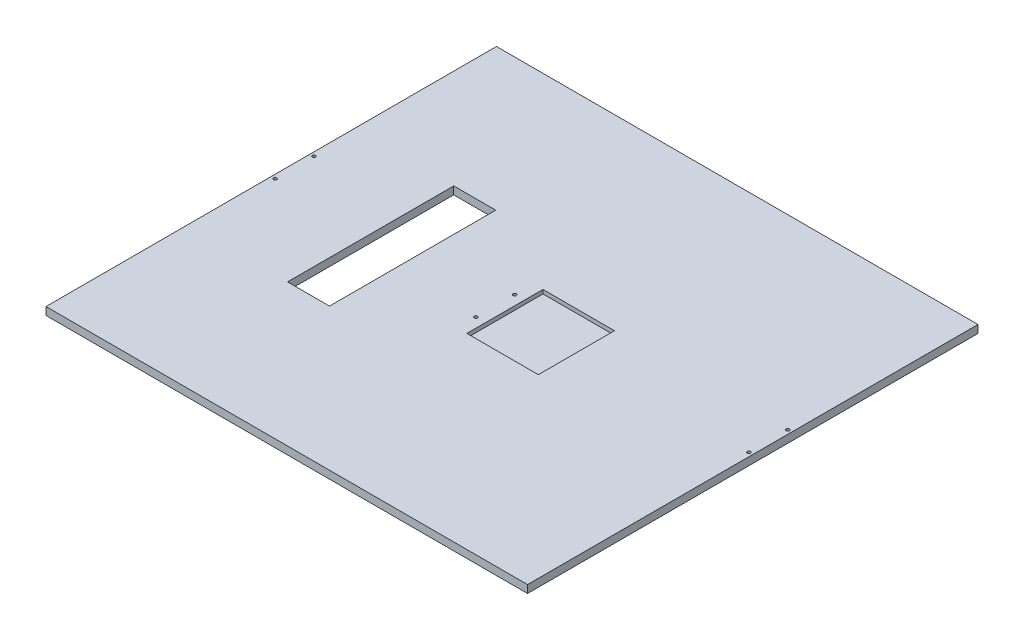
ISO-10303-21;
HEADER;
FILE_DESCRIPTION(('STEP AP214'),'2;1');
FILE_NAME('part.step','',(''),(''),'','','');
FILE_SCHEMA(('AUTOMOTIVE_DESIGN { 1 0 10303 214 1 1 1 1 }'));
ENDSEC;
DATA;
#1=APPLICATION_CONTEXT('core data for automotive mechanical design processes');
#2=APPLICATION_PROTOCOL_DEFINITION('international standard','automotive_design',2000,#1);
#3=PRODUCT_CONTEXT('',#1,'mechanical');
#4=PRODUCT('Part','Part','',(#3));
#5=PRODUCT_RELATED_PRODUCT_CATEGORY('part','',(#4));
#6=PRODUCT_DEFINITION_FORMATION('','',#4);
#7=PRODUCT_DEFINITION_CONTEXT('part definition',#1,'design');
#8=PRODUCT_DEFINITION('design','',#6,#7);
#9=PRODUCT_DEFINITION_SHAPE('','',#8);
#10=(LENGTH_UNIT() NAMED_UNIT(*) SI_UNIT(.MILLI.,.METRE.));
#11=(NAMED_UNIT(*) PLANE_ANGLE_UNIT() SI_UNIT($,.RADIAN.));
#12=(NAMED_UNIT(*) SI_UNIT($,.STERADIAN.) SOLID_ANGLE_UNIT());
#13=UNCERTAINTY_MEASURE_WITH_UNIT(LENGTH_MEASURE(1.E-05),#10,'distance_accuracy_value','');
#14=(GEOMETRIC_REPRESENTATION_CONTEXT(3) GLOBAL_UNCERTAINTY_ASSIGNED_CONTEXT((#13)) GLOBAL_UNIT_ASSIGNED_CONTEXT((#10,
#11,#12)) REPRESENTATION_CONTEXT('',''));
#15=CARTESIAN_POINT('',(0.,0.,0.));
#16=DIRECTION('',(0.,0.,1.));
#17=DIRECTION('',(1.,0.,0.));
#18=AXIS2_PLACEMENT_3D('',#15,#16,#17);
#19=CARTESIAN_POINT('',(310.,10.,-290.));
#20=DIRECTION('',(-1.,0.,0.));
#21=DIRECTION('',(0.,0.,1.));
#22=AXIS2_PLACEMENT_3D('',#19,#20,#21);
#23=PLANE('',#22);
#24=DIRECTION('',(0.,0.,-1.));
#25=VECTOR('',#24,1.);
#26=CARTESIAN_POINT('',(310.,0.,-290.));
#27=LINE('',#26,#25);
#28=CARTESIAN_POINT('',(310.,0.,290.));
#29=VERTEX_POINT('',#28);
#30=CARTESIAN_POINT('',(310.,0.,-290.));
#31=VERTEX_POINT('',#30);
#32=EDGE_CURVE('E270',#29,#31,#27,.T.);
#33=ORIENTED_EDGE('',*,*,#32,.T.);
#34=DIRECTION('',(0.,-1.,0.));
#35=VECTOR('',#34,1.);
#36=CARTESIAN_POINT('',(310.,10.,-290.));
#37=LINE('',#36,#35);
#38=CARTESIAN_POINT('',(310.,10.,-290.));
#39=VERTEX_POINT('',#38);
#40=EDGE_CURVE('E11',#39,#31,#37,.T.);
#41=ORIENTED_EDGE('',*,*,#40,.F.);
#42=DIRECTION('',(0.,0.,-1.));
#43=VECTOR('',#42,1.);
#44=CARTESIAN_POINT('',(310.,10.,-290.));
#45=LINE('',#44,#43);
#46=CARTESIAN_POINT('',(310.,10.,290.));
#47=VERTEX_POINT('',#46);
#48=EDGE_CURVE('E271',#47,#39,#45,.T.);
#49=ORIENTED_EDGE('',*,*,#48,.F.);
#50=DIRECTION('',(0.,-1.,0.));
#51=VECTOR('',#50,1.);
#52=CARTESIAN_POINT('',(310.,10.,290.));
#53=LINE('',#52,#51);
#54=EDGE_CURVE('E285',#47,#29,#53,.T.);
#55=ORIENTED_EDGE('',*,*,#54,.T.);
#56=EDGE_LOOP('',(#33,#41,#49,#55));
#57=FACE_BOUND('',#56,.T.);
#58=ADVANCED_FACE('F44',(#57),#23,.F.);
#59=CARTESIAN_POINT('',(-310.,10.,-290.));
#60=DIRECTION('',(0.,0.,1.));
#61=DIRECTION('',(1.,0.,0.));
#62=AXIS2_PLACEMENT_3D('',#59,#60,#61);
#63=PLANE('',#62);
#64=DIRECTION('',(-1.,0.,0.));
#65=VECTOR('',#64,1.);
#66=CARTESIAN_POINT('',(-310.,0.,-290.));
#67=LINE('',#66,#65);
#68=CARTESIAN_POINT('',(-310.,0.,-290.));
#69=VERTEX_POINT('',#68);
#70=EDGE_CURVE('E289',#31,#69,#67,.T.);
#71=ORIENTED_EDGE('',*,*,#70,.T.);
#72=DIRECTION('',(0.,-1.,0.));
#73=VECTOR('',#72,1.);
#74=CARTESIAN_POINT('',(-310.,10.,-290.));
#75=LINE('',#74,#73);
#76=CARTESIAN_POINT('',(-310.,10.,-290.));
#77=VERTEX_POINT('',#76);
#78=EDGE_CURVE('E53',#77,#69,#75,.T.);
#79=ORIENTED_EDGE('',*,*,#78,.F.);
#80=DIRECTION('',(-1.,0.,0.));
#81=VECTOR('',#80,1.);
#82=CARTESIAN_POINT('',(-310.,10.,-290.));
#83=LINE('',#82,#81);
#84=EDGE_CURVE('E275',#39,#77,#83,.T.);
#85=ORIENTED_EDGE('',*,*,#84,.F.);
#86=ORIENTED_EDGE('',*,*,#40,.T.);
#87=EDGE_LOOP('',(#71,#79,#85,#86));
#88=FACE_BOUND('',#87,.T.);
#89=ADVANCED_FACE('F326',(#88),#63,.F.);
#90=CARTESIAN_POINT('',(-310.,10.,-290.));
#91=DIRECTION('',(1.,0.,0.));
#92=DIRECTION('',(0.,0.,-1.));
#93=AXIS2_PLACEMENT_3D('',#90,#91,#92);
#94=PLANE('',#93);
#95=DIRECTION('',(0.,0.,1.));
#96=VECTOR('',#95,1.);
#97=CARTESIAN_POINT('',(-310.,0.,-290.));
#98=LINE('',#97,#96);
#99=CARTESIAN_POINT('',(-310.,0.,290.));
#100=VERTEX_POINT('',#99);
#101=EDGE_CURVE('E292',#69,#100,#98,.T.);
#102=ORIENTED_EDGE('',*,*,#101,.T.);
#103=DIRECTION('',(0.,-1.,0.));
#104=VECTOR('',#103,1.);
#105=CARTESIAN_POINT('',(-310.,10.,290.));
#106=LINE('',#105,#104);
#107=CARTESIAN_POINT('',(-310.,10.,290.));
#108=VERTEX_POINT('',#107);
#109=EDGE_CURVE('E300',#108,#100,#106,.T.);
#110=ORIENTED_EDGE('',*,*,#109,.F.);
#111=DIRECTION('',(0.,0.,1.));
#112=VECTOR('',#111,1.);
#113=CARTESIAN_POINT('',(-310.,10.,-290.));
#114=LINE('',#113,#112);
#115=EDGE_CURVE('E279',#77,#108,#114,.T.);
#116=ORIENTED_EDGE('',*,*,#115,.F.);
#117=ORIENTED_EDGE('',*,*,#78,.T.);
#118=EDGE_LOOP('',(#102,#110,#116,#117));
#119=FACE_BOUND('',#118,.T.);
#120=ADVANCED_FACE('F310',(#119),#94,.F.);
#121=CARTESIAN_POINT('',(-310.,10.,290.));
#122=DIRECTION('',(0.,0.,-1.));
#123=DIRECTION('',(-1.,0.,0.));
#124=AXIS2_PLACEMENT_3D('',#121,#122,#123);
#125=PLANE('',#124);
#126=DIRECTION('',(1.,0.,0.));
#127=VECTOR('',#126,1.);
#128=CARTESIAN_POINT('',(-310.,0.,290.));
#129=LINE('',#128,#127);
#130=EDGE_CURVE('E276',#100,#29,#129,.T.);
#131=ORIENTED_EDGE('',*,*,#130,.T.);
#132=ORIENTED_EDGE('',*,*,#54,.F.);
#133=DIRECTION('',(1.,0.,0.));
#134=VECTOR('',#133,1.);
#135=CARTESIAN_POINT('',(-310.,10.,290.));
#136=LINE('',#135,#134);
#137=EDGE_CURVE('E282',#108,#47,#136,.T.);
#138=ORIENTED_EDGE('',*,*,#137,.F.);
#139=ORIENTED_EDGE('',*,*,#109,.T.);
#140=EDGE_LOOP('',(#131,#132,#138,#139));
#141=FACE_BOUND('',#140,.T.);
#142=ADVANCED_FACE('F319',(#141),#125,.F.);
#143=CARTESIAN_POINT('',(0.,10.,0.));
#144=DIRECTION('',(0.,1.,0.));
#145=DIRECTION('',(0.,0.,1.));
#146=AXIS2_PLACEMENT_3D('',#143,#144,#145);
#147=PLANE('',#146);
#148=DIRECTION('',(0.,0.,-1.));
#149=VECTOR('',#148,1.);
#150=CARTESIAN_POINT('',(82.8999999999999,10.,-49.));
#151=LINE('',#150,#149);
#152=CARTESIAN_POINT('',(82.8999999999999,10.,49.));
#153=VERTEX_POINT('',#152);
#154=CARTESIAN_POINT('',(82.8999999999999,10.,-49.));
#155=VERTEX_POINT('',#154);
#156=EDGE_CURVE('E60',#153,#155,#151,.T.);
#157=ORIENTED_EDGE('',*,*,#156,.F.);
#158=DIRECTION('',(1.,0.,0.));
#159=VECTOR('',#158,1.);
#160=CARTESIAN_POINT('',(82.8999999999999,10.,49.));
#161=LINE('',#160,#159);
#162=CARTESIAN_POINT('',(-9.10000000000006,10.,49.));
#163=VERTEX_POINT('',#162);
#164=EDGE_CURVE('E157',#163,#153,#161,.T.);
#165=ORIENTED_EDGE('',*,*,#164,.F.);
#166=DIRECTION('',(0.,0.,1.));
#167=VECTOR('',#166,1.);
#168=CARTESIAN_POINT('',(-9.10000000000006,10.,-49.));
#169=LINE('',#168,#167);
#170=CARTESIAN_POINT('',(-9.10000000000006,10.,-49.));
#171=VERTEX_POINT('',#170);
#172=EDGE_CURVE('E161',#171,#163,#169,.T.);
#173=ORIENTED_EDGE('',*,*,#172,.F.);
#174=DIRECTION('',(-1.,0.,0.));
#175=VECTOR('',#174,1.);
#176=CARTESIAN_POINT('',(-9.10000000000006,10.,-49.));
#177=LINE('',#176,#175);
#178=EDGE_CURVE('E170',#155,#171,#177,.T.);
#179=ORIENTED_EDGE('',*,*,#178,.F.);
#180=EDGE_LOOP('',(#157,#165,#173,#179));
#181=FACE_BOUND('',#180,.T.);
#182=CARTESIAN_POINT('',(-21.6000000000001,10.,25.));
#183=DIRECTION('',(0.,-1.,0.));
#184=DIRECTION('',(0.,0.,-1.));
#185=AXIS2_PLACEMENT_3D('',#182,#183,#184);
#186=CIRCLE('',#185,2.1);
#187=CARTESIAN_POINT('',(-21.6000000000001,10.,22.9));
#188=VERTEX_POINT('',#187);
#189=EDGE_CURVE('E188',#188,#188,#186,.T.);
#190=ORIENTED_EDGE('',*,*,#189,.T.);
#191=EDGE_LOOP('',(#190));
#192=FACE_BOUND('',#191,.T.);
#193=CARTESIAN_POINT('',(-21.6000000000001,10.,-25.));
#194=DIRECTION('',(0.,-1.,0.));
#195=DIRECTION('',(0.,0.,-1.));
#196=AXIS2_PLACEMENT_3D('',#193,#194,#195);
#197=CIRCLE('',#196,2.1);
#198=CARTESIAN_POINT('',(-21.6000000000001,10.,-27.1));
#199=VERTEX_POINT('',#198);
#200=EDGE_CURVE('E196',#199,#199,#197,.T.);
#201=ORIENTED_EDGE('',*,*,#200,.T.);
#202=EDGE_LOOP('',(#201));
#203=FACE_BOUND('',#202,.T.);
#204=DIRECTION('',(0.,0.,1.));
#205=VECTOR('',#204,1.);
#206=CARTESIAN_POINT('',(-128.,10.,107.));
#207=LINE('',#206,#205);
#208=CARTESIAN_POINT('',(-128.,10.,-107.));
#209=VERTEX_POINT('',#208);
#210=CARTESIAN_POINT('',(-128.,10.,107.));
#211=VERTEX_POINT('',#210);
#212=EDGE_CURVE('E201',#209,#211,#207,.T.);
#213=ORIENTED_EDGE('',*,*,#212,.T.);
#214=DIRECTION('',(-1.,0.,0.));
#215=VECTOR('',#214,1.);
#216=CARTESIAN_POINT('',(-182.,10.,107.));
#217=LINE('',#216,#215);
#218=CARTESIAN_POINT('',(-182.,10.,107.));
#219=VERTEX_POINT('',#218);
#220=EDGE_CURVE('E205',#211,#219,#217,.T.);
#221=ORIENTED_EDGE('',*,*,#220,.T.);
#222=DIRECTION('',(0.,0.,-1.));
#223=VECTOR('',#222,1.);
#224=CARTESIAN_POINT('',(-182.,10.,107.));
#225=LINE('',#224,#223);
#226=CARTESIAN_POINT('',(-182.,10.,-107.));
#227=VERTEX_POINT('',#226);
#228=EDGE_CURVE('E68',#219,#227,#225,.T.);
#229=ORIENTED_EDGE('',*,*,#228,.T.);
#230=DIRECTION('',(1.,0.,0.));
#231=VECTOR('',#230,1.);
#232=CARTESIAN_POINT('',(-182.,10.,-107.));
#233=LINE('',#232,#231);
#234=EDGE_CURVE('E212',#227,#209,#233,.T.);
#235=ORIENTED_EDGE('',*,*,#234,.T.);
#236=EDGE_LOOP('',(#213,#221,#229,#235));
#237=FACE_BOUND('',#236,.T.);
#238=CARTESIAN_POINT('',(-305.,10.,-50.));
#239=DIRECTION('',(0.,1.,0.));
#240=DIRECTION('',(0.,0.,1.));
#241=AXIS2_PLACEMENT_3D('',#238,#239,#240);
#242=CIRCLE('',#241,2.09999999999999);
#243=CARTESIAN_POINT('',(-305.,10.,-47.9));
#244=VERTEX_POINT('',#243);
#245=EDGE_CURVE('E233',#244,#244,#242,.T.);
#246=ORIENTED_EDGE('',*,*,#245,.F.);
#247=EDGE_LOOP('',(#246));
#248=FACE_BOUND('',#247,.T.);
#249=CARTESIAN_POINT('',(-305.,10.,0.));
#250=DIRECTION('',(0.,1.,0.));
#251=DIRECTION('',(0.,0.,1.));
#252=AXIS2_PLACEMENT_3D('',#249,#250,#251);
#253=CIRCLE('',#252,2.09999999999999);
#254=CARTESIAN_POINT('',(-305.,10.,2.09999999999999));
#255=VERTEX_POINT('',#254);
#256=EDGE_CURVE('E246',#255,#255,#253,.T.);
#257=ORIENTED_EDGE('',*,*,#256,.F.);
#258=EDGE_LOOP('',(#257));
#259=FACE_BOUND('',#258,.T.);
#260=CARTESIAN_POINT('',(305.,10.,0.));
#261=DIRECTION('',(0.,1.,0.));
#262=DIRECTION('',(0.,0.,1.));
#263=AXIS2_PLACEMENT_3D('',#260,#261,#262);
#264=CIRCLE('',#263,2.09999999999999);
#265=CARTESIAN_POINT('',(305.,10.,2.09999999999999));
#266=VERTEX_POINT('',#265);
#267=EDGE_CURVE('E254',#266,#266,#264,.T.);
#268=ORIENTED_EDGE('',*,*,#267,.F.);
#269=EDGE_LOOP('',(#268));
#270=FACE_BOUND('',#269,.T.);
#271=CARTESIAN_POINT('',(305.,10.,-50.));
#272=DIRECTION('',(0.,1.,0.));
#273=DIRECTION('',(0.,0.,1.));
#274=AXIS2_PLACEMENT_3D('',#271,#272,#273);
#275=CIRCLE('',#274,2.09999999999999);
#276=CARTESIAN_POINT('',(305.,10.,-47.9));
#277=VERTEX_POINT('',#276);
#278=EDGE_CURVE('E262',#277,#277,#275,.T.);
#279=ORIENTED_EDGE('',*,*,#278,.F.);
#280=EDGE_LOOP('',(#279));
#281=FACE_BOUND('',#280,.T.);
#282=ORIENTED_EDGE('',*,*,#48,.T.);
#283=ORIENTED_EDGE('',*,*,#84,.T.);
#284=ORIENTED_EDGE('',*,*,#115,.T.);
#285=ORIENTED_EDGE('',*,*,#137,.T.);
#286=EDGE_LOOP('',(#282,#283,#284,#285));
#287=FACE_BOUND('',#286,.T.);
#288=ADVANCED_FACE('F325',(#181,#192,#203,#237,#248,#259,#270,#281,#287),#147,.T.);
#289=CARTESIAN_POINT('',(0.,0.,0.));
#290=DIRECTION('',(0.,1.,0.));
#291=DIRECTION('',(0.,0.,1.));
#292=AXIS2_PLACEMENT_3D('',#289,#290,#291);
#293=PLANE('',#292);
#294=CARTESIAN_POINT('',(-21.6000000000001,0.,25.));
#295=DIRECTION('',(0.,-1.,0.));
#296=DIRECTION('',(0.,0.,-1.));
#297=AXIS2_PLACEMENT_3D('',#294,#295,#296);
#298=CIRCLE('',#297,2.09999999999999);
#299=CARTESIAN_POINT('',(-21.6000000000001,0.,22.9));
#300=VERTEX_POINT('',#299);
#301=EDGE_CURVE('E179',#300,#300,#298,.T.);
#302=ORIENTED_EDGE('',*,*,#301,.F.);
#303=EDGE_LOOP('',(#302));
#304=FACE_BOUND('',#303,.T.);
#305=CARTESIAN_POINT('',(-21.6000000000001,0.,-25.));
#306=DIRECTION('',(0.,-1.,0.));
#307=DIRECTION('',(0.,0.,-1.));
#308=AXIS2_PLACEMENT_3D('',#305,#306,#307);
#309=CIRCLE('',#308,2.09999999999999);
#310=CARTESIAN_POINT('',(-21.6000000000001,0.,-27.1));
#311=VERTEX_POINT('',#310);
#312=EDGE_CURVE('E192',#311,#311,#309,.T.);
#313=ORIENTED_EDGE('',*,*,#312,.F.);
#314=EDGE_LOOP('',(#313));
#315=FACE_BOUND('',#314,.T.);
#316=DIRECTION('',(-1.,0.,0.));
#317=VECTOR('',#316,1.);
#318=CARTESIAN_POINT('',(-182.,0.,107.));
#319=LINE('',#318,#317);
#320=CARTESIAN_POINT('',(-128.,0.,107.));
#321=VERTEX_POINT('',#320);
#322=CARTESIAN_POINT('',(-182.,0.,107.));
#323=VERTEX_POINT('',#322);
#324=EDGE_CURVE('E219',#321,#323,#319,.T.);
#325=ORIENTED_EDGE('',*,*,#324,.F.);
#326=DIRECTION('',(0.,0.,1.));
#327=VECTOR('',#326,1.);
#328=CARTESIAN_POINT('',(-128.,0.,107.));
#329=LINE('',#328,#327);
#330=CARTESIAN_POINT('',(-128.,0.,-107.));
#331=VERTEX_POINT('',#330);
#332=EDGE_CURVE('E200',#331,#321,#329,.T.);
#333=ORIENTED_EDGE('',*,*,#332,.F.);
#334=DIRECTION('',(1.,0.,0.));
#335=VECTOR('',#334,1.);
#336=CARTESIAN_POINT('',(-182.,0.,-107.));
#337=LINE('',#336,#335);
#338=CARTESIAN_POINT('',(-182.,0.,-107.));
#339=VERTEX_POINT('',#338);
#340=EDGE_CURVE('E206',#339,#331,#337,.T.);
#341=ORIENTED_EDGE('',*,*,#340,.F.);
#342=DIRECTION('',(0.,0.,-1.));
#343=VECTOR('',#342,1.);
#344=CARTESIAN_POINT('',(-182.,0.,107.));
#345=LINE('',#344,#343);
#346=EDGE_CURVE('E223',#323,#339,#345,.T.);
#347=ORIENTED_EDGE('',*,*,#346,.F.);
#348=EDGE_LOOP('',(#325,#333,#341,#347));
#349=FACE_BOUND('',#348,.T.);
#350=CARTESIAN_POINT('',(-305.,0.,-50.));
#351=DIRECTION('',(0.,1.,0.));
#352=DIRECTION('',(0.,0.,1.));
#353=AXIS2_PLACEMENT_3D('',#350,#351,#352);
#354=CIRCLE('',#353,2.09999999999999);
#355=CARTESIAN_POINT('',(-305.,0.,-47.9));
#356=VERTEX_POINT('',#355);
#357=EDGE_CURVE('E47',#356,#356,#354,.T.);
#358=ORIENTED_EDGE('',*,*,#357,.T.);
#359=EDGE_LOOP('',(#358));
#360=FACE_BOUND('',#359,.T.);
#361=CARTESIAN_POINT('',(-305.,0.,0.));
#362=DIRECTION('',(0.,1.,0.));
#363=DIRECTION('',(0.,0.,1.));
#364=AXIS2_PLACEMENT_3D('',#361,#362,#363);
#365=CIRCLE('',#364,2.09999999999999);
#366=CARTESIAN_POINT('',(-305.,0.,2.09999999999999));
#367=VERTEX_POINT('',#366);
#368=EDGE_CURVE('E250',#367,#367,#365,.T.);
#369=ORIENTED_EDGE('',*,*,#368,.T.);
#370=EDGE_LOOP('',(#369));
#371=FACE_BOUND('',#370,.T.);
#372=CARTESIAN_POINT('',(305.,0.,0.));
#373=DIRECTION('',(0.,1.,0.));
#374=DIRECTION('',(0.,0.,1.));
#375=AXIS2_PLACEMENT_3D('',#372,#373,#374);
#376=CIRCLE('',#375,2.09999999999999);
#377=CARTESIAN_POINT('',(305.,0.,2.09999999999999));
#378=VERTEX_POINT('',#377);
#379=EDGE_CURVE('E258',#378,#378,#376,.T.);
#380=ORIENTED_EDGE('',*,*,#379,.T.);
#381=EDGE_LOOP('',(#380));
#382=FACE_BOUND('',#381,.T.);
#383=CARTESIAN_POINT('',(305.,0.,-50.));
#384=DIRECTION('',(0.,1.,0.));
#385=DIRECTION('',(0.,0.,1.));
#386=AXIS2_PLACEMENT_3D('',#383,#384,#385);
#387=CIRCLE('',#386,2.09999999999999);
#388=CARTESIAN_POINT('',(305.,0.,-47.9));
#389=VERTEX_POINT('',#388);
#390=EDGE_CURVE('E266',#389,#389,#387,.T.);
#391=ORIENTED_EDGE('',*,*,#390,.T.);
#392=EDGE_LOOP('',(#391));
#393=FACE_BOUND('',#392,.T.);
#394=ORIENTED_EDGE('',*,*,#32,.F.);
#395=ORIENTED_EDGE('',*,*,#130,.F.);
#396=ORIENTED_EDGE('',*,*,#101,.F.);
#397=ORIENTED_EDGE('',*,*,#70,.F.);
#398=EDGE_LOOP('',(#394,#395,#396,#397));
#399=FACE_BOUND('',#398,.T.);
#400=ADVANCED_FACE('F316',(#304,#315,#349,#360,#371,#382,#393,#399),#293,.F.);
#401=CARTESIAN_POINT('',(305.,10.,-50.));
#402=DIRECTION('',(0.,1.,0.));
#403=DIRECTION('',(0.,0.,1.));
#404=AXIS2_PLACEMENT_3D('',#401,#402,#403);
#405=CYLINDRICAL_SURFACE('',#404,2.09999999999999);
#406=ORIENTED_EDGE('',*,*,#278,.T.);
#407=EDGE_LOOP('',(#406));
#408=FACE_BOUND('',#407,.T.);
#409=ORIENTED_EDGE('',*,*,#390,.F.);
#410=EDGE_LOOP('',(#409));
#411=FACE_BOUND('',#410,.T.);
#412=ADVANCED_FACE('F338',(#408,#411),#405,.F.);
#413=CARTESIAN_POINT('',(305.,10.,0.));
#414=DIRECTION('',(0.,1.,0.));
#415=DIRECTION('',(0.,0.,1.));
#416=AXIS2_PLACEMENT_3D('',#413,#414,#415);
#417=CYLINDRICAL_SURFACE('',#416,2.09999999999999);
#418=ORIENTED_EDGE('',*,*,#267,.T.);
#419=EDGE_LOOP('',(#418));
#420=FACE_BOUND('',#419,.T.);
#421=ORIENTED_EDGE('',*,*,#379,.F.);
#422=EDGE_LOOP('',(#421));
#423=FACE_BOUND('',#422,.T.);
#424=ADVANCED_FACE('F345',(#420,#423),#417,.F.);
#425=CARTESIAN_POINT('',(-305.,10.,0.));
#426=DIRECTION('',(0.,1.,0.));
#427=DIRECTION('',(0.,0.,1.));
#428=AXIS2_PLACEMENT_3D('',#425,#426,#427);
#429=CYLINDRICAL_SURFACE('',#428,2.09999999999999);
#430=ORIENTED_EDGE('',*,*,#256,.T.);
#431=EDGE_LOOP('',(#430));
#432=FACE_BOUND('',#431,.T.);
#433=ORIENTED_EDGE('',*,*,#368,.F.);
#434=EDGE_LOOP('',(#433));
#435=FACE_BOUND('',#434,.T.);
#436=ADVANCED_FACE('F349',(#432,#435),#429,.F.);
#437=CARTESIAN_POINT('',(-305.,10.,-50.));
#438=DIRECTION('',(0.,1.,0.));
#439=DIRECTION('',(0.,0.,1.));
#440=AXIS2_PLACEMENT_3D('',#437,#438,#439);
#441=CYLINDRICAL_SURFACE('',#440,2.09999999999999);
#442=ORIENTED_EDGE('',*,*,#245,.T.);
#443=EDGE_LOOP('',(#442));
#444=FACE_BOUND('',#443,.T.);
#445=ORIENTED_EDGE('',*,*,#357,.F.);
#446=EDGE_LOOP('',(#445));
#447=FACE_BOUND('',#446,.T.);
#448=ADVANCED_FACE('F353',(#444,#447),#441,.F.);
#449=CARTESIAN_POINT('',(-128.,10.,107.));
#450=DIRECTION('',(1.,0.,0.));
#451=DIRECTION('',(0.,0.,-1.));
#452=AXIS2_PLACEMENT_3D('',#449,#450,#451);
#453=PLANE('',#452);
#454=ORIENTED_EDGE('',*,*,#332,.T.);
#455=DIRECTION('',(0.,-1.,0.));
#456=VECTOR('',#455,1.);
#457=CARTESIAN_POINT('',(-128.,10.,107.));
#458=LINE('',#457,#456);
#459=EDGE_CURVE('E216',#211,#321,#458,.T.);
#460=ORIENTED_EDGE('',*,*,#459,.F.);
#461=ORIENTED_EDGE('',*,*,#212,.F.);
#462=DIRECTION('',(0.,-1.,0.));
#463=VECTOR('',#462,1.);
#464=CARTESIAN_POINT('',(-128.,10.,-107.));
#465=LINE('',#464,#463);
#466=EDGE_CURVE('E230',#209,#331,#465,.T.);
#467=ORIENTED_EDGE('',*,*,#466,.T.);
#468=EDGE_LOOP('',(#454,#460,#461,#467));
#469=FACE_BOUND('',#468,.T.);
#470=ADVANCED_FACE('F357',(#469),#453,.F.);
#471=CARTESIAN_POINT('',(-182.,10.,-107.));
#472=DIRECTION('',(0.,0.,-1.));
#473=DIRECTION('',(-1.,0.,0.));
#474=AXIS2_PLACEMENT_3D('',#471,#472,#473);
#475=PLANE('',#474);
#476=ORIENTED_EDGE('',*,*,#340,.T.);
#477=ORIENTED_EDGE('',*,*,#466,.F.);
#478=ORIENTED_EDGE('',*,*,#234,.F.);
#479=DIRECTION('',(0.,-1.,0.));
#480=VECTOR('',#479,1.);
#481=CARTESIAN_POINT('',(-182.,10.,-107.));
#482=LINE('',#481,#480);
#483=EDGE_CURVE('E234',#227,#339,#482,.T.);
#484=ORIENTED_EDGE('',*,*,#483,.T.);
#485=EDGE_LOOP('',(#476,#477,#478,#484));
#486=FACE_BOUND('',#485,.T.);
#487=ADVANCED_FACE('F361',(#486),#475,.F.);
#488=CARTESIAN_POINT('',(-182.,10.,107.));
#489=DIRECTION('',(-1.,0.,0.));
#490=DIRECTION('',(0.,0.,1.));
#491=AXIS2_PLACEMENT_3D('',#488,#489,#490);
#492=PLANE('',#491);
#493=ORIENTED_EDGE('',*,*,#346,.T.);
#494=ORIENTED_EDGE('',*,*,#483,.F.);
#495=ORIENTED_EDGE('',*,*,#228,.F.);
#496=DIRECTION('',(0.,-1.,0.));
#497=VECTOR('',#496,1.);
#498=CARTESIAN_POINT('',(-182.,10.,107.));
#499=LINE('',#498,#497);
#500=EDGE_CURVE('E237',#219,#323,#499,.T.);
#501=ORIENTED_EDGE('',*,*,#500,.T.);
#502=EDGE_LOOP('',(#493,#494,#495,#501));
#503=FACE_BOUND('',#502,.T.);
#504=ADVANCED_FACE('F367',(#503),#492,.F.);
#505=CARTESIAN_POINT('',(-182.,10.,107.));
#506=DIRECTION('',(0.,0.,1.));
#507=DIRECTION('',(1.,0.,0.));
#508=AXIS2_PLACEMENT_3D('',#505,#506,#507);
#509=PLANE('',#508);
#510=ORIENTED_EDGE('',*,*,#324,.T.);
#511=ORIENTED_EDGE('',*,*,#500,.F.);
#512=ORIENTED_EDGE('',*,*,#220,.F.);
#513=ORIENTED_EDGE('',*,*,#459,.T.);
#514=EDGE_LOOP('',(#510,#511,#512,#513));
#515=FACE_BOUND('',#514,.T.);
#516=ADVANCED_FACE('F363',(#515),#509,.F.);
#517=CARTESIAN_POINT('',(-21.6000000000001,0.,-25.));
#518=DIRECTION('',(0.,-1.,0.));
#519=DIRECTION('',(0.,0.,-1.));
#520=AXIS2_PLACEMENT_3D('',#517,#518,#519);
#521=CYLINDRICAL_SURFACE('',#520,2.09999999999999);
#522=ORIENTED_EDGE('',*,*,#200,.F.);
#523=EDGE_LOOP('',(#522));
#524=FACE_BOUND('',#523,.T.);
#525=ORIENTED_EDGE('',*,*,#312,.T.);
#526=EDGE_LOOP('',(#525));
#527=FACE_BOUND('',#526,.T.);
#528=ADVANCED_FACE('F366',(#524,#527),#521,.F.);
#529=CARTESIAN_POINT('',(-21.6000000000001,0.,25.));
#530=DIRECTION('',(0.,-1.,0.));
#531=DIRECTION('',(0.,0.,-1.));
#532=AXIS2_PLACEMENT_3D('',#529,#530,#531);
#533=CYLINDRICAL_SURFACE('',#532,2.09999999999999);
#534=ORIENTED_EDGE('',*,*,#189,.F.);
#535=EDGE_LOOP('',(#534));
#536=FACE_BOUND('',#535,.T.);
#537=ORIENTED_EDGE('',*,*,#301,.T.);
#538=EDGE_LOOP('',(#537));
#539=FACE_BOUND('',#538,.T.);
#540=ADVANCED_FACE('F376',(#536,#539),#533,.F.);
#541=CARTESIAN_POINT('',(82.8999999999999,5.,-49.));
#542=DIRECTION('',(1.,0.,0.));
#543=DIRECTION('',(0.,0.,-1.));
#544=AXIS2_PLACEMENT_3D('',#541,#542,#543);
#545=PLANE('',#544);
#546=ORIENTED_EDGE('',*,*,#156,.T.);
#547=DIRECTION('',(0.,1.,0.));
#548=VECTOR('',#547,1.);
#549=CARTESIAN_POINT('',(82.8999999999999,5.,-49.));
#550=LINE('',#549,#548);
#551=CARTESIAN_POINT('',(82.8999999999999,5.,-49.));
#552=VERTEX_POINT('',#551);
#553=EDGE_CURVE('E132',#552,#155,#550,.T.);
#554=ORIENTED_EDGE('',*,*,#553,.F.);
#555=DIRECTION('',(0.,0.,-1.));
#556=VECTOR('',#555,1.);
#557=CARTESIAN_POINT('',(82.8999999999999,5.,-49.));
#558=LINE('',#557,#556);
#559=CARTESIAN_POINT('',(82.8999999999999,5.,49.));
#560=VERTEX_POINT('',#559);
#561=EDGE_CURVE('E136',#560,#552,#558,.T.);
#562=ORIENTED_EDGE('',*,*,#561,.F.);
#563=DIRECTION('',(0.,1.,0.));
#564=VECTOR('',#563,1.);
#565=CARTESIAN_POINT('',(82.8999999999999,5.,49.));
#566=LINE('',#565,#564);
#567=EDGE_CURVE('E176',#560,#153,#566,.T.);
#568=ORIENTED_EDGE('',*,*,#567,.T.);
#569=EDGE_LOOP('',(#546,#554,#562,#568));
#570=FACE_BOUND('',#569,.T.);
#571=ADVANCED_FACE('F134',(#570),#545,.F.);
#572=CARTESIAN_POINT('',(82.8999999999999,5.,49.));
#573=DIRECTION('',(0.,0.,1.));
#574=DIRECTION('',(1.,0.,0.));
#575=AXIS2_PLACEMENT_3D('',#572,#573,#574);
#576=PLANE('',#575);
#577=ORIENTED_EDGE('',*,*,#164,.T.);
#578=ORIENTED_EDGE('',*,*,#567,.F.);
#579=DIRECTION('',(1.,0.,0.));
#580=VECTOR('',#579,1.);
#581=CARTESIAN_POINT('',(82.8999999999999,5.,49.));
#582=LINE('',#581,#580);
#583=CARTESIAN_POINT('',(-9.10000000000006,5.,49.));
#584=VERTEX_POINT('',#583);
#585=EDGE_CURVE('E143',#584,#560,#582,.T.);
#586=ORIENTED_EDGE('',*,*,#585,.F.);
#587=DIRECTION('',(0.,1.,0.));
#588=VECTOR('',#587,1.);
#589=CARTESIAN_POINT('',(-9.10000000000006,5.,49.));
#590=LINE('',#589,#588);
#591=EDGE_CURVE('E180',#584,#163,#590,.T.);
#592=ORIENTED_EDGE('',*,*,#591,.T.);
#593=EDGE_LOOP('',(#577,#578,#586,#592));
#594=FACE_BOUND('',#593,.T.);
#595=ADVANCED_FACE('F383',(#594),#576,.F.);
#596=CARTESIAN_POINT('',(-9.10000000000006,5.,-49.));
#597=DIRECTION('',(-1.,0.,0.));
#598=DIRECTION('',(0.,0.,1.));
#599=AXIS2_PLACEMENT_3D('',#596,#597,#598);
#600=PLANE('',#599);
#601=ORIENTED_EDGE('',*,*,#172,.T.);
#602=ORIENTED_EDGE('',*,*,#591,.F.);
#603=DIRECTION('',(0.,0.,1.));
#604=VECTOR('',#603,1.);
#605=CARTESIAN_POINT('',(-9.10000000000006,5.,-49.));
#606=LINE('',#605,#604);
#607=CARTESIAN_POINT('',(-9.10000000000006,5.,-49.));
#608=VERTEX_POINT('',#607);
#609=EDGE_CURVE('E152',#608,#584,#606,.T.);
#610=ORIENTED_EDGE('',*,*,#609,.F.);
#611=DIRECTION('',(0.,1.,0.));
#612=VECTOR('',#611,1.);
#613=CARTESIAN_POINT('',(-9.10000000000006,5.,-49.));
#614=LINE('',#613,#612);
#615=EDGE_CURVE('E142',#608,#171,#614,.T.);
#616=ORIENTED_EDGE('',*,*,#615,.T.);
#617=EDGE_LOOP('',(#601,#602,#610,#616));
#618=FACE_BOUND('',#617,.T.);
#619=ADVANCED_FACE('F386',(#618),#600,.F.);
#620=CARTESIAN_POINT('',(-9.10000000000006,5.,-49.));
#621=DIRECTION('',(0.,0.,-1.));
#622=DIRECTION('',(-1.,0.,0.));
#623=AXIS2_PLACEMENT_3D('',#620,#621,#622);
#624=PLANE('',#623);
#625=ORIENTED_EDGE('',*,*,#178,.T.);
#626=ORIENTED_EDGE('',*,*,#615,.F.);
#627=DIRECTION('',(-1.,0.,0.));
#628=VECTOR('',#627,1.);
#629=CARTESIAN_POINT('',(-9.10000000000006,5.,-49.));
#630=LINE('',#629,#628);
#631=EDGE_CURVE('E146',#552,#608,#630,.T.);
#632=ORIENTED_EDGE('',*,*,#631,.F.);
#633=ORIENTED_EDGE('',*,*,#553,.T.);
#634=EDGE_LOOP('',(#625,#626,#632,#633));
#635=FACE_BOUND('',#634,.T.);
#636=ADVANCED_FACE('F147',(#635),#624,.F.);
#637=CARTESIAN_POINT('',(0.,5.,0.));
#638=DIRECTION('',(0.,-1.,0.));
#639=DIRECTION('',(0.,0.,-1.));
#640=AXIS2_PLACEMENT_3D('',#637,#638,#639);
#641=PLANE('',#640);
#642=ORIENTED_EDGE('',*,*,#561,.T.);
#643=ORIENTED_EDGE('',*,*,#631,.T.);
#644=ORIENTED_EDGE('',*,*,#609,.T.);
#645=ORIENTED_EDGE('',*,*,#585,.T.);
#646=EDGE_LOOP('',(#642,#643,#644,#645));
#647=FACE_BOUND('',#646,.T.);
#648=ADVANCED_FACE('F154',(#647),#641,.F.);
#649=CLOSED_SHELL('',(#58,#89,#120,#142,#288,#400,#412,#424,#436,#448,#470,#487,#504,#516,#528,
#540,#571,#595,#619,#636,#648));
#650=MANIFOLD_SOLID_BREP('B2',#649);
#651=ADVANCED_BREP_SHAPE_REPRESENTATION('',(#18,#650),#14);
#652=SHAPE_DEFINITION_REPRESENTATION(#9,#651);
ENDSEC;
END-ISO-10303-21;
